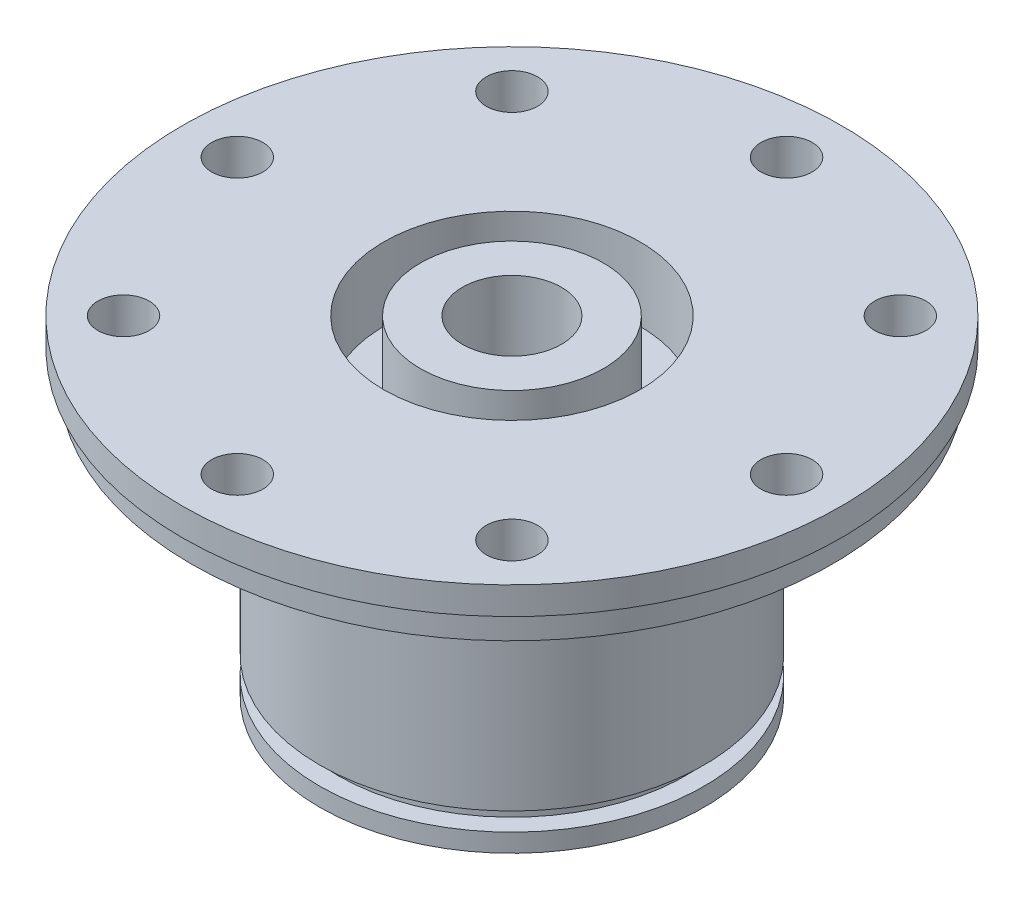
ISO-10303-21;
HEADER;
FILE_DESCRIPTION(('STEP AP214'),'2;1');
FILE_NAME('part.step','',(''),(''),'','','');
FILE_SCHEMA(('AUTOMOTIVE_DESIGN { 1 0 10303 214 1 1 1 1 }'));
ENDSEC;
DATA;
#1=APPLICATION_CONTEXT('core data for automotive mechanical design processes');
#2=APPLICATION_PROTOCOL_DEFINITION('international standard','automotive_design',2000,#1);
#3=PRODUCT_CONTEXT('',#1,'mechanical');
#4=PRODUCT('Part','Part','',(#3));
#5=PRODUCT_RELATED_PRODUCT_CATEGORY('part','',(#4));
#6=PRODUCT_DEFINITION_FORMATION('','',#4);
#7=PRODUCT_DEFINITION_CONTEXT('part definition',#1,'design');
#8=PRODUCT_DEFINITION('design','',#6,#7);
#9=PRODUCT_DEFINITION_SHAPE('','',#8);
#10=(LENGTH_UNIT() NAMED_UNIT(*) SI_UNIT(.MILLI.,.METRE.));
#11=(NAMED_UNIT(*) PLANE_ANGLE_UNIT() SI_UNIT($,.RADIAN.));
#12=(NAMED_UNIT(*) SI_UNIT($,.STERADIAN.) SOLID_ANGLE_UNIT());
#13=UNCERTAINTY_MEASURE_WITH_UNIT(LENGTH_MEASURE(1.E-05),#10,'distance_accuracy_value','');
#14=(GEOMETRIC_REPRESENTATION_CONTEXT(3) GLOBAL_UNCERTAINTY_ASSIGNED_CONTEXT((#13)) GLOBAL_UNIT_ASSIGNED_CONTEXT((#10,
#11,#12)) REPRESENTATION_CONTEXT('',''));
#15=CARTESIAN_POINT('',(0.,0.,0.));
#16=DIRECTION('',(0.,0.,1.));
#17=DIRECTION('',(1.,0.,0.));
#18=AXIS2_PLACEMENT_3D('',#15,#16,#17);
#19=CARTESIAN_POINT('',(0.,1.5,0.));
#20=DIRECTION('',(0.,1.,0.));
#21=DIRECTION('',(0.,0.,1.));
#22=AXIS2_PLACEMENT_3D('',#19,#20,#21);
#23=PLANE('',#22);
#24=CARTESIAN_POINT('',(0.,1.5,0.));
#25=DIRECTION('',(0.,1.,0.));
#26=DIRECTION('',(0.,0.,1.));
#27=AXIS2_PLACEMENT_3D('',#24,#25,#26);
#28=CIRCLE('',#27,2.705);
#29=CARTESIAN_POINT('',(0.,1.5,2.705));
#30=VERTEX_POINT('',#29);
#31=EDGE_CURVE('E78',#30,#30,#28,.T.);
#32=ORIENTED_EDGE('',*,*,#31,.F.);
#33=EDGE_LOOP('',(#32));
#34=FACE_BOUND('',#33,.T.);
#35=CARTESIAN_POINT('',(0.,1.5,0.));
#36=DIRECTION('',(0.,1.,0.));
#37=DIRECTION('',(0.,0.,1.));
#38=AXIS2_PLACEMENT_3D('',#35,#36,#37);
#39=CIRCLE('',#38,5.);
#40=CARTESIAN_POINT('',(0.,1.5,5.));
#41=VERTEX_POINT('',#40);
#42=EDGE_CURVE('E117',#41,#41,#39,.T.);
#43=ORIENTED_EDGE('',*,*,#42,.T.);
#44=EDGE_LOOP('',(#43));
#45=FACE_BOUND('',#44,.T.);
#46=ADVANCED_FACE('F35',(#34,#45),#23,.T.);
#47=CARTESIAN_POINT('',(0.,1.5,0.));
#48=DIRECTION('',(0.,-1.,0.));
#49=DIRECTION('',(0.,0.,-1.));
#50=AXIS2_PLACEMENT_3D('',#47,#48,#49);
#51=CYLINDRICAL_SURFACE('',#50,18.);
#52=CARTESIAN_POINT('',(0.,1.5,0.));
#53=DIRECTION('',(0.,1.,0.));
#54=DIRECTION('',(0.,0.,1.));
#55=AXIS2_PLACEMENT_3D('',#52,#53,#54);
#56=CIRCLE('',#55,18.);
#57=CARTESIAN_POINT('',(0.,1.5,18.));
#58=VERTEX_POINT('',#57);
#59=EDGE_CURVE('E69',#58,#58,#56,.T.);
#60=ORIENTED_EDGE('',*,*,#59,.F.);
#61=EDGE_LOOP('',(#60));
#62=FACE_BOUND('',#61,.T.);
#63=CARTESIAN_POINT('',(0.,0.,0.));
#64=DIRECTION('',(0.,1.,0.));
#65=DIRECTION('',(0.,0.,1.));
#66=AXIS2_PLACEMENT_3D('',#63,#64,#65);
#67=CIRCLE('',#66,18.);
#68=CARTESIAN_POINT('',(0.,0.,18.));
#69=VERTEX_POINT('',#68);
#70=EDGE_CURVE('E66',#69,#69,#67,.T.);
#71=ORIENTED_EDGE('',*,*,#70,.T.);
#72=EDGE_LOOP('',(#71));
#73=FACE_BOUND('',#72,.T.);
#74=ADVANCED_FACE('F37',(#62,#73),#51,.T.);
#75=CARTESIAN_POINT('',(-15.,1.5,0.));
#76=DIRECTION('',(0.,1.,0.));
#77=DIRECTION('',(1.,0.,0.));
#78=AXIS2_PLACEMENT_3D('',#75,#76,#77);
#79=CIRCLE('',#78,1.4);
#80=CARTESIAN_POINT('',(-13.6,1.5,0.));
#81=VERTEX_POINT('',#80);
#82=EDGE_CURVE('E175',#81,#81,#79,.T.);
#83=ORIENTED_EDGE('',*,*,#82,.F.);
#84=EDGE_LOOP('',(#83));
#85=FACE_BOUND('',#84,.T.);
#86=CARTESIAN_POINT('',(-10.6066017177982,1.5,10.6066017177983));
#87=DIRECTION('',(0.,1.,0.));
#88=DIRECTION('',(0.707106781186544,0.,-0.707106781186551));
#89=AXIS2_PLACEMENT_3D('',#86,#87,#88);
#90=CIRCLE('',#89,1.4);
#91=CARTESIAN_POINT('',(-9.616652224137,1.5,9.6166522241371));
#92=VERTEX_POINT('',#91);
#93=EDGE_CURVE('E179',#92,#92,#90,.T.);
#94=ORIENTED_EDGE('',*,*,#93,.F.);
#95=EDGE_LOOP('',(#94));
#96=FACE_BOUND('',#95,.T.);
#97=CARTESIAN_POINT('',(0.,1.5,15.));
#98=DIRECTION('',(0.,1.,0.));
#99=DIRECTION('',(0.,0.,-1.));
#100=AXIS2_PLACEMENT_3D('',#97,#98,#99);
#101=CIRCLE('',#100,1.4);
#102=CARTESIAN_POINT('',(0.,1.5,13.6));
#103=VERTEX_POINT('',#102);
#104=EDGE_CURVE('E183',#103,#103,#101,.T.);
#105=ORIENTED_EDGE('',*,*,#104,.F.);
#106=EDGE_LOOP('',(#105));
#107=FACE_BOUND('',#106,.T.);
#108=CARTESIAN_POINT('',(10.6066017177983,1.5,10.6066017177981));
#109=DIRECTION('',(0.,1.,0.));
#110=DIRECTION('',(-0.707106781186554,0.,-0.707106781186541));
#111=AXIS2_PLACEMENT_3D('',#108,#109,#110);
#112=CIRCLE('',#111,1.4);
#113=CARTESIAN_POINT('',(9.61665222413713,1.5,9.61665222413696));
#114=VERTEX_POINT('',#113);
#115=EDGE_CURVE('E187',#114,#114,#112,.T.);
#116=ORIENTED_EDGE('',*,*,#115,.F.);
#117=EDGE_LOOP('',(#116));
#118=FACE_BOUND('',#117,.T.);
#119=CARTESIAN_POINT('',(15.,1.5,-1.57116660247941E-13));
#120=DIRECTION('',(0.,1.,0.));
#121=DIRECTION('',(-1.,0.,0.));
#122=AXIS2_PLACEMENT_3D('',#119,#120,#121);
#123=CIRCLE('',#122,1.4);
#124=CARTESIAN_POINT('',(13.6,1.5,-1.424524386248E-13));
#125=VERTEX_POINT('',#124);
#126=EDGE_CURVE('E191',#125,#125,#123,.T.);
#127=ORIENTED_EDGE('',*,*,#126,.F.);
#128=EDGE_LOOP('',(#127));
#129=FACE_BOUND('',#128,.T.);
#130=CARTESIAN_POINT('',(10.6066017177981,1.5,-10.6066017177983));
#131=DIRECTION('',(0.,1.,0.));
#132=DIRECTION('',(-0.707106781186539,0.,0.707106781186556));
#133=AXIS2_PLACEMENT_3D('',#130,#131,#132);
#134=CIRCLE('',#133,1.4);
#135=CARTESIAN_POINT('',(9.61665222413693,1.5,-9.61665222413716));
#136=VERTEX_POINT('',#135);
#137=EDGE_CURVE('E195',#136,#136,#134,.T.);
#138=ORIENTED_EDGE('',*,*,#137,.F.);
#139=EDGE_LOOP('',(#138));
#140=FACE_BOUND('',#139,.T.);
#141=CARTESIAN_POINT('',(-10.6066017177982,1.5,-10.6066017177982));
#142=DIRECTION('',(0.,1.,0.));
#143=DIRECTION('',(0.707106781186549,0.,0.707106781186546));
#144=AXIS2_PLACEMENT_3D('',#141,#142,#143);
#145=CIRCLE('',#144,1.4);
#146=CARTESIAN_POINT('',(-9.61665222413706,1.5,-9.61665222413703));
#147=VERTEX_POINT('',#146);
#148=EDGE_CURVE('E88',#147,#147,#145,.T.);
#149=ORIENTED_EDGE('',*,*,#148,.F.);
#150=EDGE_LOOP('',(#149));
#151=FACE_BOUND('',#150,.T.);
#152=CARTESIAN_POINT('',(0.,1.5,-15.));
#153=DIRECTION('',(0.,1.,0.));
#154=DIRECTION('',(0.,0.,1.));
#155=AXIS2_PLACEMENT_3D('',#152,#153,#154);
#156=CIRCLE('',#155,1.4);
#157=CARTESIAN_POINT('',(0.,1.5,-13.6));
#158=VERTEX_POINT('',#157);
#159=EDGE_CURVE('E83',#158,#158,#156,.T.);
#160=ORIENTED_EDGE('',*,*,#159,.F.);
#161=EDGE_LOOP('',(#160));
#162=FACE_BOUND('',#161,.T.);
#163=CARTESIAN_POINT('',(0.,1.5,0.));
#164=DIRECTION('',(0.,1.,0.));
#165=DIRECTION('',(0.,0.,1.));
#166=AXIS2_PLACEMENT_3D('',#163,#164,#165);
#167=CIRCLE('',#166,7.);
#168=CARTESIAN_POINT('',(0.,1.5,7.));
#169=VERTEX_POINT('',#168);
#170=EDGE_CURVE('E113',#169,#169,#167,.T.);
#171=ORIENTED_EDGE('',*,*,#170,.F.);
#172=EDGE_LOOP('',(#171));
#173=FACE_BOUND('',#172,.T.);
#174=ORIENTED_EDGE('',*,*,#59,.T.);
#175=EDGE_LOOP('',(#174));
#176=FACE_BOUND('',#175,.T.);
#177=ADVANCED_FACE('F156',(#85,#96,#107,#118,#129,#140,#151,#162,#173,#176),#23,.T.);
#178=CARTESIAN_POINT('',(0.,0.,0.));
#179=DIRECTION('',(0.,1.,0.));
#180=DIRECTION('',(0.,0.,1.));
#181=AXIS2_PLACEMENT_3D('',#178,#179,#180);
#182=PLANE('',#181);
#183=CARTESIAN_POINT('',(0.,0.,0.));
#184=DIRECTION('',(0.,-1.,0.));
#185=DIRECTION('',(0.,0.,-1.));
#186=AXIS2_PLACEMENT_3D('',#183,#184,#185);
#187=CIRCLE('',#186,17.5);
#188=CARTESIAN_POINT('',(0.,0.,-17.5));
#189=VERTEX_POINT('',#188);
#190=EDGE_CURVE('E63',#189,#189,#187,.T.);
#191=ORIENTED_EDGE('',*,*,#190,.F.);
#192=EDGE_LOOP('',(#191));
#193=FACE_BOUND('',#192,.T.);
#194=ORIENTED_EDGE('',*,*,#70,.F.);
#195=EDGE_LOOP('',(#194));
#196=FACE_BOUND('',#195,.T.);
#197=ADVANCED_FACE('F165',(#193,#196),#182,.F.);
#198=CARTESIAN_POINT('',(0.,-1.5,0.));
#199=DIRECTION('',(0.,1.,0.));
#200=DIRECTION('',(0.,0.,1.));
#201=AXIS2_PLACEMENT_3D('',#198,#199,#200);
#202=CYLINDRICAL_SURFACE('',#201,17.5);
#203=CARTESIAN_POINT('',(0.,-1.5,0.));
#204=DIRECTION('',(0.,-1.,0.));
#205=DIRECTION('',(0.,0.,-1.));
#206=AXIS2_PLACEMENT_3D('',#203,#204,#205);
#207=CIRCLE('',#206,17.5);
#208=CARTESIAN_POINT('',(0.,-1.5,-17.5));
#209=VERTEX_POINT('',#208);
#210=EDGE_CURVE('E60',#209,#209,#207,.T.);
#211=ORIENTED_EDGE('',*,*,#210,.F.);
#212=EDGE_LOOP('',(#211));
#213=FACE_BOUND('',#212,.T.);
#214=ORIENTED_EDGE('',*,*,#190,.T.);
#215=EDGE_LOOP('',(#214));
#216=FACE_BOUND('',#215,.T.);
#217=ADVANCED_FACE('F170',(#213,#216),#202,.T.);
#218=CARTESIAN_POINT('',(0.,-1.5,0.));
#219=DIRECTION('',(0.,-1.,0.));
#220=DIRECTION('',(0.,0.,-1.));
#221=AXIS2_PLACEMENT_3D('',#218,#219,#220);
#222=PLANE('',#221);
#223=CARTESIAN_POINT('',(-15.,-1.5,0.));
#224=DIRECTION('',(0.,-1.,0.));
#225=DIRECTION('',(0.,0.,-1.));
#226=AXIS2_PLACEMENT_3D('',#223,#224,#225);
#227=CIRCLE('',#226,1.4);
#228=CARTESIAN_POINT('',(-15.,-1.5,-1.39999999999995));
#229=VERTEX_POINT('',#228);
#230=EDGE_CURVE('E39',#229,#229,#227,.T.);
#231=ORIENTED_EDGE('',*,*,#230,.F.);
#232=EDGE_LOOP('',(#231));
#233=FACE_BOUND('',#232,.T.);
#234=CARTESIAN_POINT('',(-10.6066017177982,-1.5,10.6066017177983));
#235=DIRECTION('',(0.,-1.,0.));
#236=DIRECTION('',(0.,0.,-1.));
#237=AXIS2_PLACEMENT_3D('',#234,#235,#236);
#238=CIRCLE('',#237,1.4);
#239=CARTESIAN_POINT('',(-10.6066017177982,-1.5,9.20660171779827));
#240=VERTEX_POINT('',#239);
#241=EDGE_CURVE('E99',#240,#240,#238,.T.);
#242=ORIENTED_EDGE('',*,*,#241,.F.);
#243=EDGE_LOOP('',(#242));
#244=FACE_BOUND('',#243,.T.);
#245=CARTESIAN_POINT('',(0.,-1.5,15.));
#246=DIRECTION('',(0.,-1.,0.));
#247=DIRECTION('',(0.,0.,-1.));
#248=AXIS2_PLACEMENT_3D('',#245,#246,#247);
#249=CIRCLE('',#248,1.4);
#250=CARTESIAN_POINT('',(0.,-1.5,13.6));
#251=VERTEX_POINT('',#250);
#252=EDGE_CURVE('E97',#251,#251,#249,.T.);
#253=ORIENTED_EDGE('',*,*,#252,.F.);
#254=EDGE_LOOP('',(#253));
#255=FACE_BOUND('',#254,.T.);
#256=CARTESIAN_POINT('',(10.6066017177983,-1.5,10.6066017177981));
#257=DIRECTION('',(0.,-1.,0.));
#258=DIRECTION('',(0.,0.,-1.));
#259=AXIS2_PLACEMENT_3D('',#256,#257,#258);
#260=CIRCLE('',#259,1.4);
#261=CARTESIAN_POINT('',(10.6066017177983,-1.5,9.20660171779812));
#262=VERTEX_POINT('',#261);
#263=EDGE_CURVE('E94',#262,#262,#260,.T.);
#264=ORIENTED_EDGE('',*,*,#263,.F.);
#265=EDGE_LOOP('',(#264));
#266=FACE_BOUND('',#265,.T.);
#267=CARTESIAN_POINT('',(15.,-1.5,-1.57116660247941E-13));
#268=DIRECTION('',(0.,-1.,0.));
#269=DIRECTION('',(0.,0.,-1.));
#270=AXIS2_PLACEMENT_3D('',#267,#268,#269);
#271=CIRCLE('',#270,1.4);
#272=CARTESIAN_POINT('',(15.,-1.5,-1.40000000000016));
#273=VERTEX_POINT('',#272);
#274=EDGE_CURVE('E91',#273,#273,#271,.T.);
#275=ORIENTED_EDGE('',*,*,#274,.F.);
#276=EDGE_LOOP('',(#275));
#277=FACE_BOUND('',#276,.T.);
#278=CARTESIAN_POINT('',(10.6066017177981,-1.5,-10.6066017177983));
#279=DIRECTION('',(0.,-1.,0.));
#280=DIRECTION('',(0.,0.,-1.));
#281=AXIS2_PLACEMENT_3D('',#278,#279,#280);
#282=CIRCLE('',#281,1.4);
#283=CARTESIAN_POINT('',(10.6066017177981,-1.5,-12.0066017177983));
#284=VERTEX_POINT('',#283);
#285=EDGE_CURVE('E87',#284,#284,#282,.T.);
#286=ORIENTED_EDGE('',*,*,#285,.F.);
#287=EDGE_LOOP('',(#286));
#288=FACE_BOUND('',#287,.T.);
#289=CARTESIAN_POINT('',(-10.6066017177982,-1.5,-10.6066017177982));
#290=DIRECTION('',(0.,-1.,0.));
#291=DIRECTION('',(0.,0.,-1.));
#292=AXIS2_PLACEMENT_3D('',#289,#290,#291);
#293=CIRCLE('',#292,1.4);
#294=CARTESIAN_POINT('',(-10.6066017177982,-1.5,-12.0066017177982));
#295=VERTEX_POINT('',#294);
#296=EDGE_CURVE('E84',#295,#295,#293,.T.);
#297=ORIENTED_EDGE('',*,*,#296,.F.);
#298=EDGE_LOOP('',(#297));
#299=FACE_BOUND('',#298,.T.);
#300=CARTESIAN_POINT('',(0.,-1.5,-15.));
#301=DIRECTION('',(0.,-1.,0.));
#302=DIRECTION('',(0.,0.,-1.));
#303=AXIS2_PLACEMENT_3D('',#300,#301,#302);
#304=CIRCLE('',#303,1.4);
#305=CARTESIAN_POINT('',(0.,-1.5,-16.4));
#306=VERTEX_POINT('',#305);
#307=EDGE_CURVE('E79',#306,#306,#304,.T.);
#308=ORIENTED_EDGE('',*,*,#307,.F.);
#309=EDGE_LOOP('',(#308));
#310=FACE_BOUND('',#309,.T.);
#311=CARTESIAN_POINT('',(0.,-1.5,0.));
#312=DIRECTION('',(0.,-1.,0.));
#313=DIRECTION('',(0.,0.,-1.));
#314=AXIS2_PLACEMENT_3D('',#311,#312,#313);
#315=CIRCLE('',#314,12.);
#316=CARTESIAN_POINT('',(0.,-1.5,-12.));
#317=VERTEX_POINT('',#316);
#318=EDGE_CURVE('E48',#317,#317,#315,.T.);
#319=ORIENTED_EDGE('',*,*,#318,.F.);
#320=EDGE_LOOP('',(#319));
#321=FACE_BOUND('',#320,.T.);
#322=ORIENTED_EDGE('',*,*,#210,.T.);
#323=EDGE_LOOP('',(#322));
#324=FACE_BOUND('',#323,.T.);
#325=ADVANCED_FACE('F263',(#233,#244,#255,#266,#277,#288,#299,#310,#321,#324),#222,.T.);
#326=CARTESIAN_POINT('',(0.,-2.5,0.));
#327=DIRECTION('',(0.,1.,0.));
#328=DIRECTION('',(0.,0.,1.));
#329=AXIS2_PLACEMENT_3D('',#326,#327,#328);
#330=CYLINDRICAL_SURFACE('',#329,12.);
#331=CARTESIAN_POINT('',(0.,-2.5,0.));
#332=DIRECTION('',(0.,-1.,0.));
#333=DIRECTION('',(0.,0.,-1.));
#334=AXIS2_PLACEMENT_3D('',#331,#332,#333);
#335=CIRCLE('',#334,12.);
#336=CARTESIAN_POINT('',(0.,-2.5,-12.));
#337=VERTEX_POINT('',#336);
#338=EDGE_CURVE('E56',#337,#337,#335,.T.);
#339=ORIENTED_EDGE('',*,*,#338,.F.);
#340=EDGE_LOOP('',(#339));
#341=FACE_BOUND('',#340,.T.);
#342=ORIENTED_EDGE('',*,*,#318,.T.);
#343=EDGE_LOOP('',(#342));
#344=FACE_BOUND('',#343,.T.);
#345=ADVANCED_FACE('F259',(#341,#344),#330,.T.);
#346=CARTESIAN_POINT('',(0.,-2.5,0.));
#347=DIRECTION('',(0.,-1.,0.));
#348=DIRECTION('',(0.,0.,-1.));
#349=AXIS2_PLACEMENT_3D('',#346,#347,#348);
#350=PLANE('',#349);
#351=CARTESIAN_POINT('',(0.,-2.5,0.));
#352=DIRECTION('',(0.,-1.,0.));
#353=DIRECTION('',(0.,0.,-1.));
#354=AXIS2_PLACEMENT_3D('',#351,#352,#353);
#355=CIRCLE('',#354,10.5);
#356=CARTESIAN_POINT('',(0.,-2.5,-10.5));
#357=VERTEX_POINT('',#356);
#358=EDGE_CURVE('E43',#357,#357,#355,.T.);
#359=ORIENTED_EDGE('',*,*,#358,.F.);
#360=EDGE_LOOP('',(#359));
#361=FACE_BOUND('',#360,.T.);
#362=ORIENTED_EDGE('',*,*,#338,.T.);
#363=EDGE_LOOP('',(#362));
#364=FACE_BOUND('',#363,.T.);
#365=ADVANCED_FACE('F255',(#361,#364),#350,.T.);
#366=CARTESIAN_POINT('',(0.,-14.5,0.));
#367=DIRECTION('',(0.,1.,0.));
#368=DIRECTION('',(0.,0.,1.));
#369=AXIS2_PLACEMENT_3D('',#366,#367,#368);
#370=CYLINDRICAL_SURFACE('',#369,10.5);
#371=CARTESIAN_POINT('',(0.,-14.5,0.));
#372=DIRECTION('',(0.,-1.,0.));
#373=DIRECTION('',(0.,0.,-1.));
#374=AXIS2_PLACEMENT_3D('',#371,#372,#373);
#375=CIRCLE('',#374,10.5);
#376=CARTESIAN_POINT('',(0.,-14.5,-10.5));
#377=VERTEX_POINT('',#376);
#378=EDGE_CURVE('E54',#377,#377,#375,.T.);
#379=ORIENTED_EDGE('',*,*,#378,.F.);
#380=EDGE_LOOP('',(#379));
#381=FACE_BOUND('',#380,.T.);
#382=ORIENTED_EDGE('',*,*,#358,.T.);
#383=EDGE_LOOP('',(#382));
#384=FACE_BOUND('',#383,.T.);
#385=ADVANCED_FACE('F251',(#381,#384),#370,.T.);
#386=CARTESIAN_POINT('',(0.,-14.5,0.));
#387=DIRECTION('',(0.,-1.,0.));
#388=DIRECTION('',(0.,0.,-1.));
#389=AXIS2_PLACEMENT_3D('',#386,#387,#388);
#390=PLANE('',#389);
#391=CARTESIAN_POINT('',(0.,-14.5,0.));
#392=DIRECTION('',(0.,-1.,0.));
#393=DIRECTION('',(0.,0.,-1.));
#394=AXIS2_PLACEMENT_3D('',#391,#392,#393);
#395=CIRCLE('',#394,9.5);
#396=CARTESIAN_POINT('',(0.,-14.5,-9.5));
#397=VERTEX_POINT('',#396);
#398=EDGE_CURVE('E10',#397,#397,#395,.T.);
#399=ORIENTED_EDGE('',*,*,#398,.F.);
#400=EDGE_LOOP('',(#399));
#401=FACE_BOUND('',#400,.T.);
#402=ORIENTED_EDGE('',*,*,#378,.T.);
#403=EDGE_LOOP('',(#402));
#404=FACE_BOUND('',#403,.T.);
#405=ADVANCED_FACE('F245',(#401,#404),#390,.T.);
#406=CARTESIAN_POINT('',(0.,-15.5,0.));
#407=DIRECTION('',(0.,1.,0.));
#408=DIRECTION('',(0.,0.,1.));
#409=AXIS2_PLACEMENT_3D('',#406,#407,#408);
#410=CYLINDRICAL_SURFACE('',#409,9.5);
#411=CARTESIAN_POINT('',(0.,-15.5,0.));
#412=DIRECTION('',(0.,-1.,0.));
#413=DIRECTION('',(0.,0.,-1.));
#414=AXIS2_PLACEMENT_3D('',#411,#412,#413);
#415=CIRCLE('',#414,9.5);
#416=CARTESIAN_POINT('',(0.,-15.5,-9.5));
#417=VERTEX_POINT('',#416);
#418=EDGE_CURVE('E52',#417,#417,#415,.T.);
#419=ORIENTED_EDGE('',*,*,#418,.F.);
#420=EDGE_LOOP('',(#419));
#421=FACE_BOUND('',#420,.T.);
#422=ORIENTED_EDGE('',*,*,#398,.T.);
#423=EDGE_LOOP('',(#422));
#424=FACE_BOUND('',#423,.T.);
#425=ADVANCED_FACE('F241',(#421,#424),#410,.T.);
#426=CARTESIAN_POINT('',(0.,-16.5,0.));
#427=DIRECTION('',(0.,1.,0.));
#428=DIRECTION('',(0.,0.,1.));
#429=AXIS2_PLACEMENT_3D('',#426,#427,#428);
#430=CYLINDRICAL_SURFACE('',#429,10.5);
#431=CARTESIAN_POINT('',(0.,-16.5,0.));
#432=DIRECTION('',(0.,-1.,0.));
#433=DIRECTION('',(0.,0.,-1.));
#434=AXIS2_PLACEMENT_3D('',#431,#432,#433);
#435=CIRCLE('',#434,10.5);
#436=CARTESIAN_POINT('',(0.,-16.5,-10.5));
#437=VERTEX_POINT('',#436);
#438=EDGE_CURVE('E129',#437,#437,#435,.T.);
#439=ORIENTED_EDGE('',*,*,#438,.F.);
#440=EDGE_LOOP('',(#439));
#441=FACE_BOUND('',#440,.T.);
#442=CARTESIAN_POINT('',(0.,-15.5,0.));
#443=DIRECTION('',(0.,-1.,0.));
#444=DIRECTION('',(0.,0.,-1.));
#445=AXIS2_PLACEMENT_3D('',#442,#443,#444);
#446=CIRCLE('',#445,10.5);
#447=CARTESIAN_POINT('',(0.,-15.5,-10.5));
#448=VERTEX_POINT('',#447);
#449=EDGE_CURVE('E128',#448,#448,#446,.T.);
#450=ORIENTED_EDGE('',*,*,#449,.T.);
#451=EDGE_LOOP('',(#450));
#452=FACE_BOUND('',#451,.T.);
#453=ADVANCED_FACE('F134',(#441,#452),#430,.T.);
#454=CARTESIAN_POINT('',(0.,-16.5,0.));
#455=DIRECTION('',(0.,-1.,0.));
#456=DIRECTION('',(0.,0.,-1.));
#457=AXIS2_PLACEMENT_3D('',#454,#455,#456);
#458=PLANE('',#457);
#459=CARTESIAN_POINT('',(0.,-16.5,0.));
#460=DIRECTION('',(0.,-1.,0.));
#461=DIRECTION('',(1.,0.,0.));
#462=AXIS2_PLACEMENT_3D('',#459,#460,#461);
#463=CIRCLE('',#462,8.5);
#464=CARTESIAN_POINT('',(8.5,-16.5,0.));
#465=VERTEX_POINT('',#464);
#466=EDGE_CURVE('E77',#465,#465,#463,.T.);
#467=ORIENTED_EDGE('',*,*,#466,.F.);
#468=EDGE_LOOP('',(#467));
#469=FACE_BOUND('',#468,.T.);
#470=ORIENTED_EDGE('',*,*,#438,.T.);
#471=EDGE_LOOP('',(#470));
#472=FACE_BOUND('',#471,.T.);
#473=ADVANCED_FACE('F139',(#469,#472),#458,.T.);
#474=CARTESIAN_POINT('',(0.,-15.5,0.));
#475=DIRECTION('',(0.,-1.,0.));
#476=DIRECTION('',(0.,0.,-1.));
#477=AXIS2_PLACEMENT_3D('',#474,#475,#476);
#478=PLANE('',#477);
#479=ORIENTED_EDGE('',*,*,#418,.T.);
#480=EDGE_LOOP('',(#479));
#481=FACE_BOUND('',#480,.T.);
#482=ORIENTED_EDGE('',*,*,#449,.F.);
#483=EDGE_LOOP('',(#482));
#484=FACE_BOUND('',#483,.T.);
#485=ADVANCED_FACE('F136',(#481,#484),#478,.F.);
#486=CARTESIAN_POINT('',(0.,-16.5,0.));
#487=DIRECTION('',(0.,-1.,0.));
#488=DIRECTION('',(-1.,0.,0.));
#489=AXIS2_PLACEMENT_3D('',#486,#487,#488);
#490=SPHERICAL_SURFACE('',#489,8.5);
#491=CARTESIAN_POINT('',(0.,-8.44190003785011,0.));
#492=DIRECTION('',(0.,-1.,0.));
#493=DIRECTION('',(0.,0.,-1.));
#494=AXIS2_PLACEMENT_3D('',#491,#492,#493);
#495=CIRCLE('',#494,2.705);
#496=CARTESIAN_POINT('',(0.,-8.44190003785011,-2.705));
#497=VERTEX_POINT('',#496);
#498=EDGE_CURVE('E74',#497,#497,#495,.T.);
#499=ORIENTED_EDGE('',*,*,#498,.F.);
#500=EDGE_LOOP('',(#499));
#501=FACE_BOUND('',#500,.T.);
#502=ORIENTED_EDGE('',*,*,#466,.T.);
#503=EDGE_LOOP('',(#502));
#504=FACE_BOUND('',#503,.T.);
#505=ADVANCED_FACE('F138',(#501,#504),#490,.F.);
#506=CARTESIAN_POINT('',(0.,-16.5,0.));
#507=DIRECTION('',(0.,1.,0.));
#508=DIRECTION('',(0.,0.,1.));
#509=AXIS2_PLACEMENT_3D('',#506,#507,#508);
#510=CYLINDRICAL_SURFACE('',#509,2.705);
#511=ORIENTED_EDGE('',*,*,#498,.T.);
#512=EDGE_LOOP('',(#511));
#513=FACE_BOUND('',#512,.T.);
#514=ORIENTED_EDGE('',*,*,#31,.T.);
#515=EDGE_LOOP('',(#514));
#516=FACE_BOUND('',#515,.T.);
#517=ADVANCED_FACE('F146',(#513,#516),#510,.F.);
#518=CARTESIAN_POINT('',(0.,-22.2989898732233,0.));
#519=DIRECTION('',(0.,1.,0.));
#520=DIRECTION('',(0.,0.,1.));
#521=AXIS2_PLACEMENT_3D('',#518,#519,#520);
#522=CYLINDRICAL_SURFACE('',#521,7.);
#523=CARTESIAN_POINT('',(0.,-2.5,0.));
#524=DIRECTION('',(0.,-1.,0.));
#525=DIRECTION('',(0.,0.,-1.));
#526=AXIS2_PLACEMENT_3D('',#523,#524,#525);
#527=CIRCLE('',#526,7.);
#528=CARTESIAN_POINT('',(0.,-2.5,7.));
#529=VERTEX_POINT('',#528);
#530=EDGE_CURVE('E82',#529,#529,#527,.F.);
#531=CARTESIAN_POINT('',(0.,1.5,7.));
#532=CARTESIAN_POINT('',(0.,1.45833333333333,7.));
#533=CARTESIAN_POINT('',(0.,1.41666666666666,7.));
#534=CARTESIAN_POINT('',(0.,1.33333333333333,7.));
#535=CARTESIAN_POINT('',(0.,1.29166666666666,7.));
#536=CARTESIAN_POINT('',(0.,1.20833333333333,7.));
#537=CARTESIAN_POINT('',(0.,1.16666666666666,7.));
#538=CARTESIAN_POINT('',(0.,1.08333333333333,7.));
#539=CARTESIAN_POINT('',(0.,1.04166666666666,7.));
#540=CARTESIAN_POINT('',(0.,0.958333333333331,7.));
#541=CARTESIAN_POINT('',(0.,0.916666666666664,7.));
#542=CARTESIAN_POINT('',(0.,0.833333333333331,7.));
#543=CARTESIAN_POINT('',(0.,0.791666666666664,7.));
#544=CARTESIAN_POINT('',(0.,0.70833333333333,7.));
#545=CARTESIAN_POINT('',(0.,0.666666666666664,7.));
#546=CARTESIAN_POINT('',(0.,0.58333333333333,7.));
#547=CARTESIAN_POINT('',(0.,0.541666666666664,7.));
#548=CARTESIAN_POINT('',(0.,0.458333333333331,7.));
#549=CARTESIAN_POINT('',(0.,0.416666666666666,7.));
#550=CARTESIAN_POINT('',(0.,0.333333333333334,7.));
#551=CARTESIAN_POINT('',(0.,0.291666666666667,7.));
#552=CARTESIAN_POINT('',(0.,0.208333333333334,7.));
#553=CARTESIAN_POINT('',(0.,0.166666666666667,7.));
#554=CARTESIAN_POINT('',(0.,0.0833333333333334,7.));
#555=CARTESIAN_POINT('',(0.,0.0416666666666667,7.));
#556=CARTESIAN_POINT('',(0.,-0.0416666666666667,7.));
#557=CARTESIAN_POINT('',(0.,-0.0833333333333334,7.));
#558=CARTESIAN_POINT('',(0.,-0.166666666666667,7.));
#559=CARTESIAN_POINT('',(0.,-0.208333333333334,7.));
#560=CARTESIAN_POINT('',(0.,-0.291666666666667,7.));
#561=CARTESIAN_POINT('',(0.,-0.333333333333334,7.));
#562=CARTESIAN_POINT('',(0.,-0.416666666666667,7.));
#563=CARTESIAN_POINT('',(0.,-0.458333333333334,7.));
#564=CARTESIAN_POINT('',(0.,-0.541666666666667,7.));
#565=CARTESIAN_POINT('',(0.,-0.583333333333334,7.));
#566=CARTESIAN_POINT('',(0.,-0.666666666666667,7.));
#567=CARTESIAN_POINT('',(0.,-0.708333333333334,7.));
#568=CARTESIAN_POINT('',(0.,-0.791666666666667,7.));
#569=CARTESIAN_POINT('',(0.,-0.833333333333334,7.));
#570=CARTESIAN_POINT('',(0.,-0.916666666666668,7.));
#571=CARTESIAN_POINT('',(0.,-0.958333333333334,7.));
#572=CARTESIAN_POINT('',(0.,-1.04166666666667,7.));
#573=CARTESIAN_POINT('',(0.,-1.08333333333333,7.));
#574=CARTESIAN_POINT('',(0.,-1.16666666666667,7.));
#575=CARTESIAN_POINT('',(0.,-1.20833333333333,7.));
#576=CARTESIAN_POINT('',(0.,-1.29166666666667,7.));
#577=CARTESIAN_POINT('',(0.,-1.33333333333333,7.));
#578=CARTESIAN_POINT('',(0.,-1.41666666666666,7.));
#579=CARTESIAN_POINT('',(0.,-1.45833333333333,7.));
#580=CARTESIAN_POINT('',(0.,-1.54166666666666,7.));
#581=CARTESIAN_POINT('',(0.,-1.58333333333333,7.));
#582=CARTESIAN_POINT('',(0.,-1.66666666666666,7.));
#583=CARTESIAN_POINT('',(0.,-1.70833333333333,7.));
#584=CARTESIAN_POINT('',(0.,-1.79166666666666,7.));
#585=CARTESIAN_POINT('',(0.,-1.83333333333333,7.));
#586=CARTESIAN_POINT('',(0.,-1.91666666666666,7.));
#587=CARTESIAN_POINT('',(0.,-1.95833333333333,7.));
#588=CARTESIAN_POINT('',(0.,-2.04166666666667,7.));
#589=CARTESIAN_POINT('',(0.,-2.08333333333333,7.));
#590=CARTESIAN_POINT('',(0.,-2.16666666666667,7.));
#591=CARTESIAN_POINT('',(0.,-2.20833333333333,7.));
#592=CARTESIAN_POINT('',(0.,-2.29166666666667,7.));
#593=CARTESIAN_POINT('',(0.,-2.33333333333333,7.));
#594=CARTESIAN_POINT('',(0.,-2.41666666666667,7.));
#595=CARTESIAN_POINT('',(0.,-2.45833333333333,7.));
#596=CARTESIAN_POINT('',(0.,-2.5,7.));
#597=B_SPLINE_CURVE_WITH_KNOTS('',3,(#531,#532,#533,#534,#535,#536,#537,#538,#539,#540,#541,
#542,#543,#544,#545,#546,#547,#548,#549,#550,#551,#552,#553,#554,#555,#556,#557,#558,#559,#560,
#561,#562,#563,#564,#565,#566,#567,#568,#569,#570,#571,#572,#573,#574,#575,#576,#577,#578,#579,
#580,#581,#582,#583,#584,#585,#586,#587,#588,#589,#590,#591,#592,#593,#594,#595,#596),
.UNSPECIFIED.,.F.,.F.,(4,2,2,2,2,2,2,2,2,2,2,2,2,2,2,2,2,2,2,2,2,2,2,2,2,2,2,2,2,2,2,2,4),(0.,
0.125,0.25,0.375,0.5,0.625000000000001,0.750000000000001,0.875000000000001,1.,1.125,1.25,1.375,
1.5,1.625,1.75,1.875,2.,2.125,2.25,2.375,2.5,2.625,2.75,2.875,3.,3.125,3.25,3.375,3.5,3.625,
3.75,3.875,4.),.UNSPECIFIED.);
#598=EDGE_CURVE('BSEAM207',#169,#529,#597,.T.);
#599=ORIENTED_EDGE('',*,*,#170,.T.);
#600=ORIENTED_EDGE('',*,*,#530,.F.);
#601=ORIENTED_EDGE('',*,*,#598,.T.);
#602=ORIENTED_EDGE('',*,*,#598,.F.);
#603=EDGE_LOOP('',(#599,#601,#600,#602));
#604=FACE_BOUND('',#603,.T.);
#605=ADVANCED_FACE('F207',(#604),#522,.F.);
#606=CARTESIAN_POINT('',(0.,-22.2989898732233,0.));
#607=DIRECTION('',(0.,1.,0.));
#608=DIRECTION('',(0.,0.,1.));
#609=AXIS2_PLACEMENT_3D('',#606,#607,#608);
#610=CYLINDRICAL_SURFACE('',#609,5.);
#611=CARTESIAN_POINT('',(0.,-2.5,0.));
#612=DIRECTION('',(0.,-1.,0.));
#613=DIRECTION('',(0.,0.,-1.));
#614=AXIS2_PLACEMENT_3D('',#611,#612,#613);
#615=CIRCLE('',#614,5.);
#616=CARTESIAN_POINT('',(0.,-2.5,5.));
#617=VERTEX_POINT('',#616);
#618=EDGE_CURVE('E116',#617,#617,#615,.F.);
#619=CARTESIAN_POINT('',(0.,1.5,5.));
#620=CARTESIAN_POINT('',(0.,1.45833333333333,5.));
#621=CARTESIAN_POINT('',(0.,1.41666666666666,5.));
#622=CARTESIAN_POINT('',(0.,1.33333333333333,5.));
#623=CARTESIAN_POINT('',(0.,1.29166666666666,5.));
#624=CARTESIAN_POINT('',(0.,1.20833333333333,5.));
#625=CARTESIAN_POINT('',(0.,1.16666666666666,5.));
#626=CARTESIAN_POINT('',(0.,1.08333333333333,5.));
#627=CARTESIAN_POINT('',(0.,1.04166666666666,5.));
#628=CARTESIAN_POINT('',(0.,0.958333333333331,5.));
#629=CARTESIAN_POINT('',(0.,0.916666666666664,5.));
#630=CARTESIAN_POINT('',(0.,0.833333333333331,5.));
#631=CARTESIAN_POINT('',(0.,0.791666666666664,5.));
#632=CARTESIAN_POINT('',(0.,0.70833333333333,5.));
#633=CARTESIAN_POINT('',(0.,0.666666666666664,5.));
#634=CARTESIAN_POINT('',(0.,0.58333333333333,5.));
#635=CARTESIAN_POINT('',(0.,0.541666666666664,5.));
#636=CARTESIAN_POINT('',(0.,0.458333333333331,5.));
#637=CARTESIAN_POINT('',(0.,0.416666666666666,5.));
#638=CARTESIAN_POINT('',(0.,0.333333333333334,5.));
#639=CARTESIAN_POINT('',(0.,0.291666666666667,5.));
#640=CARTESIAN_POINT('',(0.,0.208333333333334,5.));
#641=CARTESIAN_POINT('',(0.,0.166666666666667,5.));
#642=CARTESIAN_POINT('',(0.,0.0833333333333334,5.));
#643=CARTESIAN_POINT('',(0.,0.0416666666666667,5.));
#644=CARTESIAN_POINT('',(0.,-0.0416666666666667,5.));
#645=CARTESIAN_POINT('',(0.,-0.0833333333333334,5.));
#646=CARTESIAN_POINT('',(0.,-0.166666666666667,5.));
#647=CARTESIAN_POINT('',(0.,-0.208333333333334,5.));
#648=CARTESIAN_POINT('',(0.,-0.291666666666667,5.));
#649=CARTESIAN_POINT('',(0.,-0.333333333333334,5.));
#650=CARTESIAN_POINT('',(0.,-0.416666666666667,5.));
#651=CARTESIAN_POINT('',(0.,-0.458333333333334,5.));
#652=CARTESIAN_POINT('',(0.,-0.541666666666667,5.));
#653=CARTESIAN_POINT('',(0.,-0.583333333333334,5.));
#654=CARTESIAN_POINT('',(0.,-0.666666666666667,5.));
#655=CARTESIAN_POINT('',(0.,-0.708333333333334,5.));
#656=CARTESIAN_POINT('',(0.,-0.791666666666667,5.));
#657=CARTESIAN_POINT('',(0.,-0.833333333333334,5.));
#658=CARTESIAN_POINT('',(0.,-0.916666666666668,5.));
#659=CARTESIAN_POINT('',(0.,-0.958333333333334,5.));
#660=CARTESIAN_POINT('',(0.,-1.04166666666667,5.));
#661=CARTESIAN_POINT('',(0.,-1.08333333333333,5.));
#662=CARTESIAN_POINT('',(0.,-1.16666666666667,5.));
#663=CARTESIAN_POINT('',(0.,-1.20833333333333,5.));
#664=CARTESIAN_POINT('',(0.,-1.29166666666667,5.));
#665=CARTESIAN_POINT('',(0.,-1.33333333333333,5.));
#666=CARTESIAN_POINT('',(0.,-1.41666666666666,5.));
#667=CARTESIAN_POINT('',(0.,-1.45833333333333,5.));
#668=CARTESIAN_POINT('',(0.,-1.54166666666666,5.));
#669=CARTESIAN_POINT('',(0.,-1.58333333333333,5.));
#670=CARTESIAN_POINT('',(0.,-1.66666666666666,5.));
#671=CARTESIAN_POINT('',(0.,-1.70833333333333,5.));
#672=CARTESIAN_POINT('',(0.,-1.79166666666666,5.));
#673=CARTESIAN_POINT('',(0.,-1.83333333333333,5.));
#674=CARTESIAN_POINT('',(0.,-1.91666666666666,5.));
#675=CARTESIAN_POINT('',(0.,-1.95833333333333,5.));
#676=CARTESIAN_POINT('',(0.,-2.04166666666667,5.));
#677=CARTESIAN_POINT('',(0.,-2.08333333333333,5.));
#678=CARTESIAN_POINT('',(0.,-2.16666666666667,5.));
#679=CARTESIAN_POINT('',(0.,-2.20833333333333,5.));
#680=CARTESIAN_POINT('',(0.,-2.29166666666667,5.));
#681=CARTESIAN_POINT('',(0.,-2.33333333333333,5.));
#682=CARTESIAN_POINT('',(0.,-2.41666666666667,5.));
#683=CARTESIAN_POINT('',(0.,-2.45833333333333,5.));
#684=CARTESIAN_POINT('',(0.,-2.5,5.));
#685=B_SPLINE_CURVE_WITH_KNOTS('',3,(#619,#620,#621,#622,#623,#624,#625,#626,#627,#628,#629,
#630,#631,#632,#633,#634,#635,#636,#637,#638,#639,#640,#641,#642,#643,#644,#645,#646,#647,#648,
#649,#650,#651,#652,#653,#654,#655,#656,#657,#658,#659,#660,#661,#662,#663,#664,#665,#666,#667,
#668,#669,#670,#671,#672,#673,#674,#675,#676,#677,#678,#679,#680,#681,#682,#683,#684),
.UNSPECIFIED.,.F.,.F.,(4,2,2,2,2,2,2,2,2,2,2,2,2,2,2,2,2,2,2,2,2,2,2,2,2,2,2,2,2,2,2,2,4),(0.,
0.125,0.25,0.375,0.5,0.625000000000001,0.750000000000001,0.875000000000001,1.,1.125,1.25,1.375,
1.5,1.625,1.75,1.875,2.,2.125,2.25,2.375,2.5,2.625,2.75,2.875,3.,3.125,3.25,3.375,3.5,3.625,
3.75,3.875,4.),.UNSPECIFIED.);
#686=EDGE_CURVE('BSEAM210',#41,#617,#685,.T.);
#687=ORIENTED_EDGE('',*,*,#42,.F.);
#688=ORIENTED_EDGE('',*,*,#618,.T.);
#689=ORIENTED_EDGE('',*,*,#686,.T.);
#690=ORIENTED_EDGE('',*,*,#686,.F.);
#691=EDGE_LOOP('',(#687,#689,#688,#690));
#692=FACE_BOUND('',#691,.T.);
#693=ADVANCED_FACE('F210',(#692),#610,.T.);
#694=CARTESIAN_POINT('',(0.,-2.5,0.));
#695=DIRECTION('',(0.,-1.,0.));
#696=DIRECTION('',(0.,0.,-1.));
#697=AXIS2_PLACEMENT_3D('',#694,#695,#696);
#698=PLANE('',#697);
#699=ORIENTED_EDGE('',*,*,#530,.T.);
#700=EDGE_LOOP('',(#699));
#701=FACE_BOUND('',#700,.T.);
#702=ORIENTED_EDGE('',*,*,#618,.F.);
#703=EDGE_LOOP('',(#702));
#704=FACE_BOUND('',#703,.T.);
#705=ADVANCED_FACE('F214',(#701,#704),#698,.F.);
#706=CARTESIAN_POINT('',(0.,-3.5,-15.));
#707=DIRECTION('',(0.,1.,0.));
#708=DIRECTION('',(0.,0.,1.));
#709=AXIS2_PLACEMENT_3D('',#706,#707,#708);
#710=CYLINDRICAL_SURFACE('',#709,1.4);
#711=ORIENTED_EDGE('',*,*,#307,.T.);
#712=EDGE_LOOP('',(#711));
#713=FACE_BOUND('',#712,.T.);
#714=ORIENTED_EDGE('',*,*,#159,.T.);
#715=EDGE_LOOP('',(#714));
#716=FACE_BOUND('',#715,.T.);
#717=ADVANCED_FACE('F217',(#713,#716),#710,.F.);
#718=CARTESIAN_POINT('',(-10.6066017177982,-3.5,-10.6066017177982));
#719=DIRECTION('',(0.,1.,0.));
#720=DIRECTION('',(0.,0.,1.));
#721=AXIS2_PLACEMENT_3D('',#718,#719,#720);
#722=CYLINDRICAL_SURFACE('',#721,1.4);
#723=ORIENTED_EDGE('',*,*,#296,.T.);
#724=EDGE_LOOP('',(#723));
#725=FACE_BOUND('',#724,.T.);
#726=ORIENTED_EDGE('',*,*,#148,.T.);
#727=EDGE_LOOP('',(#726));
#728=FACE_BOUND('',#727,.T.);
#729=ADVANCED_FACE('F363',(#725,#728),#722,.F.);
#730=CARTESIAN_POINT('',(10.6066017177981,-3.5,-10.6066017177983));
#731=DIRECTION('',(0.,1.,0.));
#732=DIRECTION('',(0.,0.,1.));
#733=AXIS2_PLACEMENT_3D('',#730,#731,#732);
#734=CYLINDRICAL_SURFACE('',#733,1.4);
#735=ORIENTED_EDGE('',*,*,#285,.T.);
#736=EDGE_LOOP('',(#735));
#737=FACE_BOUND('',#736,.T.);
#738=ORIENTED_EDGE('',*,*,#137,.T.);
#739=EDGE_LOOP('',(#738));
#740=FACE_BOUND('',#739,.T.);
#741=ADVANCED_FACE('F423',(#737,#740),#734,.F.);
#742=CARTESIAN_POINT('',(15.,-3.5,-1.57116660247941E-13));
#743=DIRECTION('',(0.,1.,0.));
#744=DIRECTION('',(0.,0.,1.));
#745=AXIS2_PLACEMENT_3D('',#742,#743,#744);
#746=CYLINDRICAL_SURFACE('',#745,1.4);
#747=ORIENTED_EDGE('',*,*,#274,.T.);
#748=EDGE_LOOP('',(#747));
#749=FACE_BOUND('',#748,.T.);
#750=ORIENTED_EDGE('',*,*,#126,.T.);
#751=EDGE_LOOP('',(#750));
#752=FACE_BOUND('',#751,.T.);
#753=ADVANCED_FACE('F430',(#749,#752),#746,.F.);
#754=CARTESIAN_POINT('',(10.6066017177983,-3.5,10.6066017177981));
#755=DIRECTION('',(0.,1.,0.));
#756=DIRECTION('',(0.,0.,1.));
#757=AXIS2_PLACEMENT_3D('',#754,#755,#756);
#758=CYLINDRICAL_SURFACE('',#757,1.4);
#759=ORIENTED_EDGE('',*,*,#263,.T.);
#760=EDGE_LOOP('',(#759));
#761=FACE_BOUND('',#760,.T.);
#762=ORIENTED_EDGE('',*,*,#115,.T.);
#763=EDGE_LOOP('',(#762));
#764=FACE_BOUND('',#763,.T.);
#765=ADVANCED_FACE('F438',(#761,#764),#758,.F.);
#766=CARTESIAN_POINT('',(0.,-3.5,15.));
#767=DIRECTION('',(0.,1.,0.));
#768=DIRECTION('',(0.,0.,1.));
#769=AXIS2_PLACEMENT_3D('',#766,#767,#768);
#770=CYLINDRICAL_SURFACE('',#769,1.4);
#771=ORIENTED_EDGE('',*,*,#252,.T.);
#772=EDGE_LOOP('',(#771));
#773=FACE_BOUND('',#772,.T.);
#774=ORIENTED_EDGE('',*,*,#104,.T.);
#775=EDGE_LOOP('',(#774));
#776=FACE_BOUND('',#775,.T.);
#777=ADVANCED_FACE('F446',(#773,#776),#770,.F.);
#778=CARTESIAN_POINT('',(-10.6066017177982,-3.5,10.6066017177983));
#779=DIRECTION('',(0.,1.,0.));
#780=DIRECTION('',(0.,0.,1.));
#781=AXIS2_PLACEMENT_3D('',#778,#779,#780);
#782=CYLINDRICAL_SURFACE('',#781,1.4);
#783=ORIENTED_EDGE('',*,*,#241,.T.);
#784=EDGE_LOOP('',(#783));
#785=FACE_BOUND('',#784,.T.);
#786=ORIENTED_EDGE('',*,*,#93,.T.);
#787=EDGE_LOOP('',(#786));
#788=FACE_BOUND('',#787,.T.);
#789=ADVANCED_FACE('F454',(#785,#788),#782,.F.);
#790=CARTESIAN_POINT('',(-15.,-3.5,0.));
#791=DIRECTION('',(0.,1.,0.));
#792=DIRECTION('',(0.,0.,1.));
#793=AXIS2_PLACEMENT_3D('',#790,#791,#792);
#794=CYLINDRICAL_SURFACE('',#793,1.4);
#795=ORIENTED_EDGE('',*,*,#230,.T.);
#796=EDGE_LOOP('',(#795));
#797=FACE_BOUND('',#796,.T.);
#798=ORIENTED_EDGE('',*,*,#82,.T.);
#799=EDGE_LOOP('',(#798));
#800=FACE_BOUND('',#799,.T.);
#801=ADVANCED_FACE('F462',(#797,#800),#794,.F.);
#802=CLOSED_SHELL('',(#46,#74,#177,#197,#217,#325,#345,#365,#385,#405,#425,#453,#473,#485,#505,
#517,#605,#693,#705,#717,#729,#741,#753,#765,#777,#789,#801));
#803=MANIFOLD_SOLID_BREP('B2',#802);
#804=ADVANCED_BREP_SHAPE_REPRESENTATION('',(#18,#803),#14);
#805=SHAPE_DEFINITION_REPRESENTATION(#9,#804);
ENDSEC;
END-ISO-10303-21;
